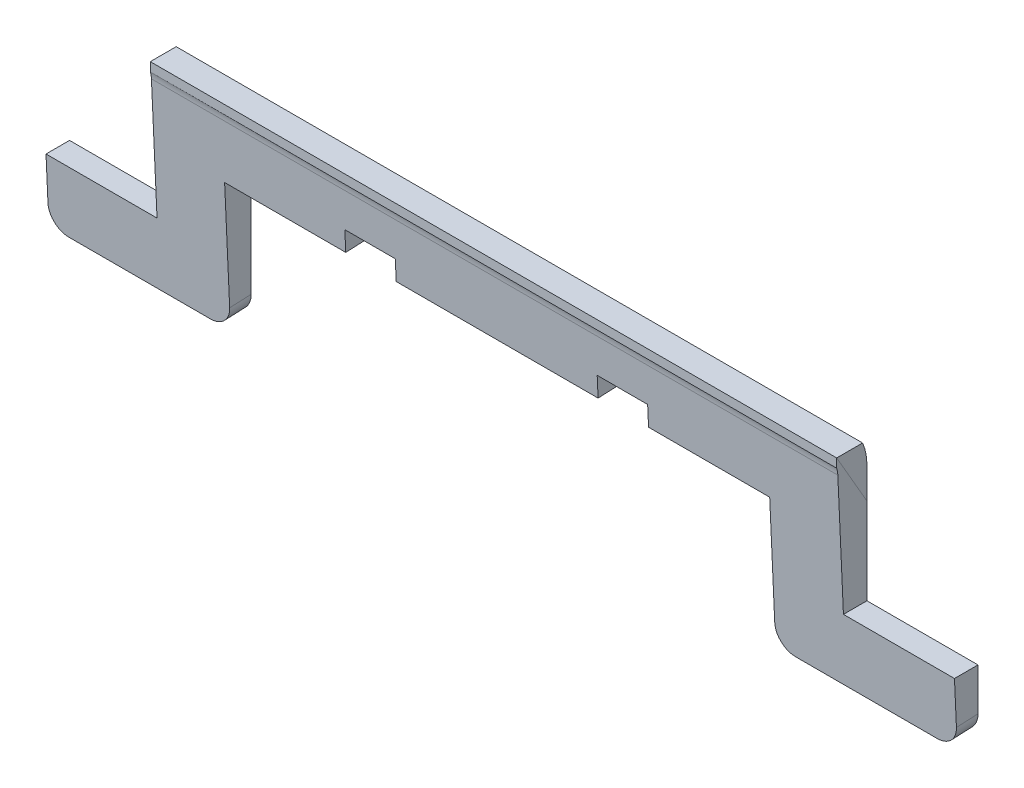
ISO-10303-21;
HEADER;
FILE_DESCRIPTION(('STEP AP214'),'2;1');
FILE_NAME('part.step','',(''),(''),'','','');
FILE_SCHEMA(('AUTOMOTIVE_DESIGN { 1 0 10303 214 1 1 1 1 }'));
ENDSEC;
DATA;
#1=APPLICATION_CONTEXT('core data for automotive mechanical design processes');
#2=APPLICATION_PROTOCOL_DEFINITION('international standard','automotive_design',2000,#1);
#3=PRODUCT_CONTEXT('',#1,'mechanical');
#4=PRODUCT('Part','Part','',(#3));
#5=PRODUCT_RELATED_PRODUCT_CATEGORY('part','',(#4));
#6=PRODUCT_DEFINITION_FORMATION('','',#4);
#7=PRODUCT_DEFINITION_CONTEXT('part definition',#1,'design');
#8=PRODUCT_DEFINITION('design','',#6,#7);
#9=PRODUCT_DEFINITION_SHAPE('','',#8);
#10=(LENGTH_UNIT() NAMED_UNIT(*) SI_UNIT(.MILLI.,.METRE.));
#11=(NAMED_UNIT(*) PLANE_ANGLE_UNIT() SI_UNIT($,.RADIAN.));
#12=(NAMED_UNIT(*) SI_UNIT($,.STERADIAN.) SOLID_ANGLE_UNIT());
#13=UNCERTAINTY_MEASURE_WITH_UNIT(LENGTH_MEASURE(1.E-05),#10,'distance_accuracy_value','');
#14=(GEOMETRIC_REPRESENTATION_CONTEXT(3) GLOBAL_UNCERTAINTY_ASSIGNED_CONTEXT((#13)) GLOBAL_UNIT_ASSIGNED_CONTEXT((#10,
#11,#12)) REPRESENTATION_CONTEXT('',''));
#15=CARTESIAN_POINT('',(0.,0.,0.));
#16=DIRECTION('',(0.,0.,1.));
#17=DIRECTION('',(1.,0.,0.));
#18=AXIS2_PLACEMENT_3D('',#15,#16,#17);
#19=CARTESIAN_POINT('',(-1.35000000265,0.81213740353,-1.75));
#20=DIRECTION('',(7.902277659215E-09,1.,0.));
#21=DIRECTION('',(0.,0.,-1.));
#22=AXIS2_PLACEMENT_3D('',#19,#20,#21);
#23=PLANE('',#22);
#24=DIRECTION('',(0.,0.,1.));
#25=VECTOR('',#24,1.);
#26=CARTESIAN_POINT('',(-2.25,0.812137410642,-1.76781401));
#27=LINE('',#26,#25);
#28=CARTESIAN_POINT('',(-2.25,0.812137410642,-1.75));
#29=VERTEX_POINT('',#28);
#30=CARTESIAN_POINT('',(-2.25,0.812137410642,-1.633424097895));
#31=VERTEX_POINT('',#30);
#32=EDGE_CURVE('E392',#29,#31,#27,.T.);
#33=ORIENTED_EDGE('',*,*,#32,.T.);
#34=DIRECTION('',(1.,-7.902277659215E-09,-3.591944409949E-10));
#35=VECTOR('',#34,1.);
#36=CARTESIAN_POINT('',(-1.800000000058,0.812137407086,-1.633424098055));
#37=LINE('',#36,#35);
#38=CARTESIAN_POINT('',(-1.699999996704,0.812137406296,-1.633424098091));
#39=VERTEX_POINT('',#38);
#40=EDGE_CURVE('E539',#31,#39,#37,.T.);
#41=ORIENTED_EDGE('',*,*,#40,.T.);
#42=DIRECTION('',(0.,0.,1.));
#43=VECTOR('',#42,1.);
#44=CARTESIAN_POINT('',(-1.699999996704,0.812137406296,-1.75));
#45=LINE('',#44,#43);
#46=CARTESIAN_POINT('',(-1.699999996704,0.812137406296,-1.75));
#47=VERTEX_POINT('',#46);
#48=EDGE_CURVE('E11',#47,#39,#45,.T.);
#49=ORIENTED_EDGE('',*,*,#48,.F.);
#50=DIRECTION('',(-1.,7.902277659215E-09,0.));
#51=VECTOR('',#50,1.);
#52=CARTESIAN_POINT('',(-1.850000003015,0.812137407481,-1.75));
#53=LINE('',#52,#51);
#54=EDGE_CURVE('E342',#47,#29,#53,.T.);
#55=ORIENTED_EDGE('',*,*,#54,.T.);
#56=EDGE_LOOP('',(#33,#41,#49,#55));
#57=FACE_BOUND('',#56,.T.);
#58=ADVANCED_FACE('F16',(#57),#23,.T.);
#59=CARTESIAN_POINT('',(-1.699999990368,1.613879977042,-1.75));
#60=DIRECTION('',(-1.,7.902277525616E-09,0.));
#61=DIRECTION('',(0.,0.,1.));
#62=AXIS2_PLACEMENT_3D('',#59,#60,#61);
#63=PLANE('',#62);
#64=DIRECTION('',(0.,0.866025403784329,0.50000000000019));
#65=VECTOR('',#64,1.);
#66=CARTESIAN_POINT('',(-1.7,1.240192378865,-1.75));
#67=LINE('',#66,#65);
#68=CARTESIAN_POINT('',(-1.700000000033,1.240192378865,-1.75));
#69=VERTEX_POINT('',#68);
#70=CARTESIAN_POINT('',(-1.700000000953,1.5,-1.6));
#71=VERTEX_POINT('',#70);
#72=EDGE_CURVE('E378',#69,#71,#67,.T.);
#73=ORIENTED_EDGE('',*,*,#72,.F.);
#74=DIRECTION('',(-7.902277525616E-09,-1.,0.));
#75=VECTOR('',#74,1.);
#76=CARTESIAN_POINT('',(-1.699999991846,1.426939985953,-1.75));
#77=LINE('',#76,#75);
#78=EDGE_CURVE('E347',#69,#47,#77,.T.);
#79=ORIENTED_EDGE('',*,*,#78,.T.);
#80=ORIENTED_EDGE('',*,*,#48,.T.);
#81=DIRECTION('',(7.89412664401439E-09,0.998968540199176,0.045407661163358));
#82=VECTOR('',#81,1.);
#83=CARTESIAN_POINT('',(-1.699999994807,1.052203238069,-1.62251201477));
#84=LINE('',#83,#82);
#85=CARTESIAN_POINT('',(-1.700000000458,1.423370555856,-1.605640773923));
#86=VERTEX_POINT('',#85);
#87=EDGE_CURVE('E445',#39,#86,#84,.T.);
#88=ORIENTED_EDGE('',*,*,#87,.T.);
#89=CARTESIAN_POINT('',(-1.700000000915,1.41746756,-1.475774863));
#90=DIRECTION('',(1.,0.,0.));
#91=DIRECTION('',(0.,-1.,0.));
#92=AXIS2_PLACEMENT_3D('',#89,#90,#91);
#93=CIRCLE('',#92,0.130000001);
#94=CARTESIAN_POINT('',(-1.700000000915,1.455783556013,-1.600000000189));
#95=VERTEX_POINT('',#94);
#96=EDGE_CURVE('E404',#86,#95,#93,.T.);
#97=ORIENTED_EDGE('',*,*,#96,.T.);
#98=DIRECTION('',(-7.902277525616E-09,-1.,0.));
#99=VECTOR('',#98,1.);
#100=CARTESIAN_POINT('',(-1.699999992868,1.297593171494,-1.6));
#101=LINE('',#100,#99);
#102=EDGE_CURVE('E335',#71,#95,#101,.T.);
#103=ORIENTED_EDGE('',*,*,#102,.F.);
#104=EDGE_LOOP('',(#73,#79,#80,#88,#97,#103));
#105=FACE_BOUND('',#104,.T.);
#106=ADVANCED_FACE('F623',(#105),#63,.T.);
#107=CARTESIAN_POINT('',(1.699999998271,0.681198360928,-1.75));
#108=DIRECTION('',(1.,-7.902277525616E-09,0.));
#109=DIRECTION('',(0.,0.,-1.));
#110=AXIS2_PLACEMENT_3D('',#107,#108,#109);
#111=PLANE('',#110);
#112=DIRECTION('',(-7.89412664401439E-09,-0.998968540199176,-0.045407661163358));
#113=VECTOR('',#112,1.);
#114=CARTESIAN_POINT('',(1.699999997525,0.586823944055,-1.643665619157));
#115=LINE('',#114,#113);
#116=CARTESIAN_POINT('',(1.700000000665,1.423370555965,-1.605640773591));
#117=VERTEX_POINT('',#116);
#118=CARTESIAN_POINT('',(1.699999999306,0.812137379428,-1.633424099312));
#119=VERTEX_POINT('',#118);
#120=EDGE_CURVE('E441',#117,#119,#115,.T.);
#121=ORIENTED_EDGE('',*,*,#120,.T.);
#122=DIRECTION('',(0.,0.,1.));
#123=VECTOR('',#122,1.);
#124=CARTESIAN_POINT('',(1.699999999306,0.812137379428,-1.75));
#125=LINE('',#124,#123);
#126=CARTESIAN_POINT('',(1.699999999306,0.812137379428,-1.75));
#127=VERTEX_POINT('',#126);
#128=EDGE_CURVE('E27',#127,#119,#125,.T.);
#129=ORIENTED_EDGE('',*,*,#128,.F.);
#130=DIRECTION('',(7.902277525616E-09,1.,0.));
#131=VECTOR('',#130,1.);
#132=CARTESIAN_POINT('',(1.700000000479,0.960599164462,-1.75));
#133=LINE('',#132,#131);
#134=CARTESIAN_POINT('',(1.6999999996,1.240192378926,-1.750000000128));
#135=VERTEX_POINT('',#134);
#136=EDGE_CURVE('E440',#127,#135,#133,.T.);
#137=ORIENTED_EDGE('',*,*,#136,.T.);
#138=DIRECTION('',(0.,-0.866025403784329,-0.50000000000019));
#139=VECTOR('',#138,1.);
#140=CARTESIAN_POINT('',(1.6999999996,1.240192378926,-1.75));
#141=LINE('',#140,#139);
#142=CARTESIAN_POINT('',(1.7000000002,1.5,-1.600000000035));
#143=VERTEX_POINT('',#142);
#144=EDGE_CURVE('E496',#143,#135,#141,.T.);
#145=ORIENTED_EDGE('',*,*,#144,.F.);
#146=DIRECTION('',(7.902277525616E-09,1.,0.));
#147=VECTOR('',#146,1.);
#148=CARTESIAN_POINT('',(1.699999999457,0.831252350003,-1.6));
#149=LINE('',#148,#147);
#150=CARTESIAN_POINT('',(1.700000000336,1.455783556074,-1.600000000147));
#151=VERTEX_POINT('',#150);
#152=EDGE_CURVE('E369',#151,#143,#149,.T.);
#153=ORIENTED_EDGE('',*,*,#152,.F.);
#154=CARTESIAN_POINT('',(1.700000000665,1.41746756,-1.475774863));
#155=DIRECTION('',(-1.,0.,0.));
#156=DIRECTION('',(0.,-1.,0.));
#157=AXIS2_PLACEMENT_3D('',#154,#155,#156);
#158=CIRCLE('',#157,0.130000001);
#159=EDGE_CURVE('E313',#151,#117,#158,.T.);
#160=ORIENTED_EDGE('',*,*,#159,.T.);
#161=EDGE_LOOP('',(#121,#129,#137,#145,#153,#160));
#162=FACE_BOUND('',#161,.T.);
#163=ADVANCED_FACE('F629',(#162),#111,.T.);
#164=CARTESIAN_POINT('',(2.400105974106,0.812137373895,-1.75));
#165=DIRECTION('',(7.902277525616E-09,1.,0.));
#166=DIRECTION('',(0.,0.,-1.));
#167=AXIS2_PLACEMENT_3D('',#164,#165,#166);
#168=PLANE('',#167);
#169=DIRECTION('',(0.,0.,-1.));
#170=VECTOR('',#169,1.);
#171=CARTESIAN_POINT('',(2.25,0.812137375082,-1.6965932535));
#172=LINE('',#171,#170);
#173=CARTESIAN_POINT('',(2.25,0.812137375082,-1.633424099241));
#174=VERTEX_POINT('',#173);
#175=CARTESIAN_POINT('',(2.25,0.812137375082,-1.75));
#176=VERTEX_POINT('',#175);
#177=EDGE_CURVE('E20',#174,#176,#172,.T.);
#178=ORIENTED_EDGE('',*,*,#177,.T.);
#179=DIRECTION('',(-1.,7.902277525616E-09,0.));
#180=VECTOR('',#179,1.);
#181=CARTESIAN_POINT('',(0.02505298536236,0.812137392664,-1.75));
#182=LINE('',#181,#180);
#183=EDGE_CURVE('E306',#176,#127,#182,.T.);
#184=ORIENTED_EDGE('',*,*,#183,.T.);
#185=ORIENTED_EDGE('',*,*,#128,.T.);
#186=DIRECTION('',(1.,-7.902277525616E-09,-3.591944349222E-10));
#187=VECTOR('',#186,1.);
#188=CARTESIAN_POINT('',(0.07505298831971,0.812137392269,-1.633424098729));
#189=LINE('',#188,#187);
#190=EDGE_CURVE('E446',#119,#174,#189,.T.);
#191=ORIENTED_EDGE('',*,*,#190,.T.);
#192=EDGE_LOOP('',(#178,#184,#185,#191));
#193=FACE_BOUND('',#192,.T.);
#194=ADVANCED_FACE('F648',(#193),#168,.T.);
#195=CARTESIAN_POINT('',(-2.25,0.49746756,-1.647727273));
#196=DIRECTION('',(0.,0.045407661163358,-0.998968540199176));
#197=DIRECTION('',(-1.,0.,0.));
#198=AXIS2_PLACEMENT_3D('',#195,#196,#197);
#199=PLANE('',#198);
#200=ORIENTED_EDGE('',*,*,#190,.F.);
#201=ORIENTED_EDGE('',*,*,#120,.F.);
#202=DIRECTION('',(-1.,0.,0.));
#203=VECTOR('',#202,1.);
#204=CARTESIAN_POINT('',(1.72216727,1.423370555992,-1.605640774225));
#205=LINE('',#204,#203);
#206=EDGE_CURVE('E482',#117,#86,#205,.T.);
#207=ORIENTED_EDGE('',*,*,#206,.T.);
#208=ORIENTED_EDGE('',*,*,#87,.F.);
#209=ORIENTED_EDGE('',*,*,#40,.F.);
#210=DIRECTION('',(0.,-0.998968540182468,-0.0454076615309513));
#211=VECTOR('',#210,1.);
#212=CARTESIAN_POINT('',(-2.25,0.869994434875,-1.630794233121));
#213=LINE('',#212,#211);
#214=CARTESIAN_POINT('',(-2.25,0.597364413251,-1.643186506999));
#215=VERTEX_POINT('',#214);
#216=EDGE_CURVE('E381',#31,#215,#213,.T.);
#217=ORIENTED_EDGE('',*,*,#216,.T.);
#218=CARTESIAN_POINT('',(-2.150000000774,0.597364413247,-1.643186506919));
#219=DIRECTION('',(0.,-0.0454076611633578,0.998968540199176));
#220=DIRECTION('',(0.,0.998968540199176,0.0454076611633578));
#221=AXIS2_PLACEMENT_3D('',#218,#219,#220);
#222=CIRCLE('',#221,0.09999999922649);
#223=CARTESIAN_POINT('',(-2.150000000774,0.497467560004,-1.647727273091));
#224=VERTEX_POINT('',#223);
#225=EDGE_CURVE('E418',#215,#224,#222,.T.);
#226=ORIENTED_EDGE('',*,*,#225,.T.);
#227=DIRECTION('',(1.,0.,0.));
#228=VECTOR('',#227,1.);
#229=CARTESIAN_POINT('',(-2.15,0.497467560004,-1.647727273091));
#230=LINE('',#229,#228);
#231=CARTESIAN_POINT('',(-1.449999999226,0.497467560004,-1.647727273091));
#232=VERTEX_POINT('',#231);
#233=EDGE_CURVE('E321',#224,#232,#230,.T.);
#234=ORIENTED_EDGE('',*,*,#233,.T.);
#235=CARTESIAN_POINT('',(-1.449999999226,0.597364413247,-1.643186506919));
#236=DIRECTION('',(0.,-0.0454076611633578,0.998968540199176));
#237=DIRECTION('',(0.,0.998968540199176,0.0454076611633578));
#238=AXIS2_PLACEMENT_3D('',#235,#236,#237);
#239=CIRCLE('',#238,0.09999999922649);
#240=CARTESIAN_POINT('',(-1.35,0.597364413252,-1.643186507022));
#241=VERTEX_POINT('',#240);
#242=EDGE_CURVE('E435',#232,#241,#239,.T.);
#243=ORIENTED_EDGE('',*,*,#242,.T.);
#244=DIRECTION('',(0.,0.998968540190678,0.0454076613503353));
#245=VECTOR('',#244,1.);
#246=CARTESIAN_POINT('',(-1.35,0.597364413631,-1.643186507005));
#247=LINE('',#246,#245);
#248=CARTESIAN_POINT('',(-1.35,1.147467559702,-1.618181818309));
#249=VERTEX_POINT('',#248);
#250=EDGE_CURVE('E331',#241,#249,#247,.T.);
#251=ORIENTED_EDGE('',*,*,#250,.T.);
#252=DIRECTION('',(1.,0.,0.));
#253=VECTOR('',#252,1.);
#254=CARTESIAN_POINT('',(-1.35,1.147467560013,-1.618181818294));
#255=LINE('',#254,#253);
#256=CARTESIAN_POINT('',(-0.75,1.147467560013,-1.618181818294));
#257=VERTEX_POINT('',#256);
#258=EDGE_CURVE('E483',#249,#257,#255,.T.);
#259=ORIENTED_EDGE('',*,*,#258,.T.);
#260=DIRECTION('',(0.,-0.998968540199176,-0.045407661163358));
#261=VECTOR('',#260,1.);
#262=CARTESIAN_POINT('',(-0.75,1.247467559705,-1.613636363738));
#263=LINE('',#262,#261);
#264=CARTESIAN_POINT('',(-0.75,1.247467559705,-1.613636363738));
#265=VERTEX_POINT('',#264);
#266=EDGE_CURVE('E489',#265,#257,#263,.T.);
#267=ORIENTED_EDGE('',*,*,#266,.F.);
#268=DIRECTION('',(1.,0.,0.));
#269=VECTOR('',#268,1.);
#270=CARTESIAN_POINT('',(-0.75,1.247467559705,-1.613636363738));
#271=LINE('',#270,#269);
#272=CARTESIAN_POINT('',(-0.499999999667,1.247467559767,-1.613636365107));
#273=VERTEX_POINT('',#272);
#274=EDGE_CURVE('E348',#265,#273,#271,.T.);
#275=ORIENTED_EDGE('',*,*,#274,.T.);
#276=DIRECTION('',(0.,0.998968540199176,0.045407661163358));
#277=VECTOR('',#276,1.);
#278=CARTESIAN_POINT('',(-0.499999999667,1.147467559843,-1.618181820771));
#279=LINE('',#278,#277);
#280=CARTESIAN_POINT('',(-0.499999999667,1.147467559806,-1.61818181995));
#281=VERTEX_POINT('',#280);
#282=EDGE_CURVE('E430',#281,#273,#279,.T.);
#283=ORIENTED_EDGE('',*,*,#282,.F.);
#284=DIRECTION('',(-1.,0.,0.));
#285=VECTOR('',#284,1.);
#286=CARTESIAN_POINT('',(-0.499999999667,1.147467559843,-1.618181820771));
#287=LINE('',#286,#285);
#288=CARTESIAN_POINT('',(0.499999999667,1.147467559806,-1.61818181995));
#289=VERTEX_POINT('',#288);
#290=EDGE_CURVE('E575',#289,#281,#287,.T.);
#291=ORIENTED_EDGE('',*,*,#290,.F.);
#292=DIRECTION('',(0.,0.998968540199176,0.045407661163358));
#293=VECTOR('',#292,1.);
#294=CARTESIAN_POINT('',(0.499999999667,1.147467559843,-1.618181820771));
#295=LINE('',#294,#293);
#296=CARTESIAN_POINT('',(0.499999999667,1.247467559743,-1.61363636456));
#297=VERTEX_POINT('',#296);
#298=EDGE_CURVE('E459',#289,#297,#295,.T.);
#299=ORIENTED_EDGE('',*,*,#298,.T.);
#300=DIRECTION('',(1.,0.,0.));
#301=VECTOR('',#300,1.);
#302=CARTESIAN_POINT('',(-0.75,1.247467559705,-1.613636363738));
#303=LINE('',#302,#301);
#304=CARTESIAN_POINT('',(0.750000001,1.247467559705,-1.613636363738));
#305=VERTEX_POINT('',#304);
#306=EDGE_CURVE('E352',#297,#305,#303,.T.);
#307=ORIENTED_EDGE('',*,*,#306,.T.);
#308=DIRECTION('',(0.,-0.998968540199176,-0.045407661163358));
#309=VECTOR('',#308,1.);
#310=CARTESIAN_POINT('',(0.750000001,1.247467559705,-1.613636363738));
#311=LINE('',#310,#309);
#312=CARTESIAN_POINT('',(0.750000001,1.147467560013,-1.618181818294));
#313=VERTEX_POINT('',#312);
#314=EDGE_CURVE('E533',#305,#313,#311,.T.);
#315=ORIENTED_EDGE('',*,*,#314,.T.);
#316=DIRECTION('',(1.,0.,0.));
#317=VECTOR('',#316,1.);
#318=CARTESIAN_POINT('',(0.75,1.147467560013,-1.618181818294));
#319=LINE('',#318,#317);
#320=CARTESIAN_POINT('',(1.35,1.147467560013,-1.618181818294));
#321=VERTEX_POINT('',#320);
#322=EDGE_CURVE('E467',#313,#321,#319,.T.);
#323=ORIENTED_EDGE('',*,*,#322,.T.);
#324=DIRECTION('',(0.,-0.998968540192551,-0.0454076613091296));
#325=VECTOR('',#324,1.);
#326=CARTESIAN_POINT('',(1.35,1.147467559547,-1.618181818316));
#327=LINE('',#326,#325);
#328=CARTESIAN_POINT('',(1.35,0.597364413251,-1.643186506999));
#329=VERTEX_POINT('',#328);
#330=EDGE_CURVE('E500',#321,#329,#327,.T.);
#331=ORIENTED_EDGE('',*,*,#330,.T.);
#332=CARTESIAN_POINT('',(1.449999999226,0.597364413247,-1.643186506919));
#333=DIRECTION('',(0.,-0.0454076611633578,0.998968540199176));
#334=DIRECTION('',(0.,0.998968540199176,0.0454076611633578));
#335=AXIS2_PLACEMENT_3D('',#332,#333,#334);
#336=CIRCLE('',#335,0.09999999922649);
#337=CARTESIAN_POINT('',(1.449999999226,0.497467560004,-1.647727273091));
#338=VERTEX_POINT('',#337);
#339=EDGE_CURVE('E360',#329,#338,#336,.T.);
#340=ORIENTED_EDGE('',*,*,#339,.T.);
#341=DIRECTION('',(1.,0.,0.));
#342=VECTOR('',#341,1.);
#343=CARTESIAN_POINT('',(1.45,0.497467560004,-1.647727273091));
#344=LINE('',#343,#342);
#345=CARTESIAN_POINT('',(2.150000000774,0.497467560004,-1.647727273091));
#346=VERTEX_POINT('',#345);
#347=EDGE_CURVE('E529',#338,#346,#344,.T.);
#348=ORIENTED_EDGE('',*,*,#347,.T.);
#349=CARTESIAN_POINT('',(2.150000000774,0.597364413247,-1.643186506919));
#350=DIRECTION('',(0.,-0.0454076611633578,0.998968540199176));
#351=DIRECTION('',(0.,0.998968540199176,0.0454076611633578));
#352=AXIS2_PLACEMENT_3D('',#349,#350,#351);
#353=CIRCLE('',#352,0.09999999922649);
#354=CARTESIAN_POINT('',(2.25,0.597364413252,-1.643186507028));
#355=VERTEX_POINT('',#354);
#356=EDGE_CURVE('E292',#346,#355,#353,.T.);
#357=ORIENTED_EDGE('',*,*,#356,.T.);
#358=DIRECTION('',(0.,0.998968540119427,0.0454076629178494));
#359=VECTOR('',#358,1.);
#360=CARTESIAN_POINT('',(2.25,0.597364413816,-1.643186507002));
#361=LINE('',#360,#359);
#362=EDGE_CURVE('E289',#355,#174,#361,.T.);
#363=ORIENTED_EDGE('',*,*,#362,.T.);
#364=EDGE_LOOP('',(#200,#201,#207,#208,#209,#217,#226,#234,#243,#251,#259,#267,#275,#283,#291,
#299,#307,#315,#323,#331,#340,#348,#357,#363));
#365=FACE_BOUND('',#364,.T.);
#366=ADVANCED_FACE('F603',(#365),#199,.F.);
#367=CARTESIAN_POINT('',(2.150000000774,0.603839027256,-1.785628020102));
#368=DIRECTION('',(0.,-0.0454076593280117,0.998968540282601));
#369=DIRECTION('',(0.,-0.998968540282601,-0.0454076593280117));
#370=AXIS2_PLACEMENT_3D('',#367,#368,#369);
#371=CYLINDRICAL_SURFACE('',#370,0.09999999922649);
#372=CARTESIAN_POINT('',(2.150000000774,0.502116320155,-1.75));
#373=CARTESIAN_POINT('',(2.20857864408358,0.502116320155,-1.75));
#374=CARTESIAN_POINT('',(2.25000000000049,0.543580444645959,-1.75));
#375=CARTESIAN_POINT('',(2.25,0.602219571853,-1.75));
#376=(BOUNDED_CURVE() B_SPLINE_CURVE(3,(#372,#373,#374,#375),.UNSPECIFIED.,.F.,
.F.) B_SPLINE_CURVE_WITH_KNOTS((4,4),(0.,1.5707963267949),
.UNSPECIFIED.) CURVE() GEOMETRIC_REPRESENTATION_ITEM() RATIONAL_B_SPLINE_CURVE((1.,
0.804737854124365,0.804737854124365,1.)) REPRESENTATION_ITEM(''));
#377=CARTESIAN_POINT('',(2.150000000774,0.502116320155,-1.75));
#378=VERTEX_POINT('',#377);
#379=CARTESIAN_POINT('',(2.25,0.602219571853,-1.75));
#380=VERTEX_POINT('',#379);
#381=EDGE_CURVE('E295',#378,#380,#376,.T.);
#382=ORIENTED_EDGE('',*,*,#381,.T.);
#383=DIRECTION('',(0.,0.0454076593280119,-0.998968540282601));
#384=VECTOR('',#383,1.);
#385=CARTESIAN_POINT('',(2.25,0.597364413252,-1.643186507034));
#386=LINE('',#385,#384);
#387=EDGE_CURVE('E281',#355,#380,#386,.T.);
#388=ORIENTED_EDGE('',*,*,#387,.F.);
#389=ORIENTED_EDGE('',*,*,#356,.F.);
#390=DIRECTION('',(0.,-0.0454076593280119,0.998968540282601));
#391=VECTOR('',#390,1.);
#392=CARTESIAN_POINT('',(2.150000000774,0.503942174,-1.790168786));
#393=LINE('',#392,#391);
#394=EDGE_CURVE('E298',#378,#346,#393,.T.);
#395=ORIENTED_EDGE('',*,*,#394,.F.);
#396=EDGE_LOOP('',(#382,#388,#389,#395));
#397=FACE_BOUND('',#396,.T.);
#398=ADVANCED_FACE('F296',(#397),#371,.T.);
#399=CARTESIAN_POINT('',(2.25,0.597364414,-1.643186507));
#400=DIRECTION('',(-1.,0.,0.));
#401=DIRECTION('',(0.,0.,1.));
#402=AXIS2_PLACEMENT_3D('',#399,#400,#401);
#403=PLANE('',#402);
#404=ORIENTED_EDGE('',*,*,#177,.F.);
#405=ORIENTED_EDGE('',*,*,#362,.F.);
#406=ORIENTED_EDGE('',*,*,#387,.T.);
#407=DIRECTION('',(0.,1.,0.));
#408=VECTOR('',#407,1.);
#409=CARTESIAN_POINT('',(2.25,0.662994821677,-1.75));
#410=LINE('',#409,#408);
#411=EDGE_CURVE('E286',#380,#176,#410,.T.);
#412=ORIENTED_EDGE('',*,*,#411,.T.);
#413=EDGE_LOOP('',(#404,#405,#406,#412));
#414=FACE_BOUND('',#413,.T.);
#415=ADVANCED_FACE('F284',(#414),#403,.F.);
#416=CARTESIAN_POINT('',(1.7,0.908438211,-1.573580715));
#417=DIRECTION('',(1.,0.,0.));
#418=DIRECTION('',(0.,1.,0.));
#419=AXIS2_PLACEMENT_3D('',#416,#417,#418);
#420=PLANE('',#419);
#421=DIRECTION('',(0.,1.,0.));
#422=VECTOR('',#421,1.);
#423=CARTESIAN_POINT('',(1.7,0.818531720177,-1.75));
#424=LINE('',#423,#422);
#425=CARTESIAN_POINT('',(1.6999999998,1.387655462182,-1.75));
#426=VERTEX_POINT('',#425);
#427=EDGE_CURVE('E376',#135,#426,#424,.T.);
#428=ORIENTED_EDGE('',*,*,#427,.T.);
#429=DIRECTION('',(0.,-0.998968540201401,-0.0454076611144282));
#430=VECTOR('',#429,1.);
#431=CARTESIAN_POINT('',(1.6999999998,0.503942174,-1.790168786));
#432=LINE('',#431,#430);
#433=CARTESIAN_POINT('',(1.6999999998,1.411408062279,-1.748920336355));
#434=VERTEX_POINT('',#433);
#435=EDGE_CURVE('E390',#434,#426,#432,.T.);
#436=ORIENTED_EDGE('',*,*,#435,.F.);
#437=CARTESIAN_POINT('',(1.7,1.400056147,-1.499178201304));
#438=DIRECTION('',(1.,0.,0.));
#439=DIRECTION('',(0.,0.,-1.));
#440=AXIS2_PLACEMENT_3D('',#437,#438,#439);
#441=CIRCLE('',#440,0.25);
#442=CARTESIAN_POINT('',(1.7,1.5,-1.728331482423));
#443=VERTEX_POINT('',#442);
#444=EDGE_CURVE('E528',#434,#443,#441,.T.);
#445=ORIENTED_EDGE('',*,*,#444,.T.);
#446=DIRECTION('',(0.,0.,1.));
#447=VECTOR('',#446,1.);
#448=CARTESIAN_POINT('',(1.7,1.5,-0.906512355152));
#449=LINE('',#448,#447);
#450=EDGE_CURVE('E351',#443,#143,#449,.T.);
#451=ORIENTED_EDGE('',*,*,#450,.T.);
#452=ORIENTED_EDGE('',*,*,#144,.T.);
#453=EDGE_LOOP('',(#428,#436,#445,#451,#452));
#454=FACE_BOUND('',#453,.T.);
#455=ADVANCED_FACE('F1006',(#454),#420,.T.);
#456=CARTESIAN_POINT('',(-2.25,0.503942174,-1.790168786));
#457=DIRECTION('',(0.,0.0454076611144282,-0.998968540201401));
#458=DIRECTION('',(-1.,0.,0.));
#459=AXIS2_PLACEMENT_3D('',#456,#457,#458);
#460=PLANE('',#459);
#461=DIRECTION('',(-1.,0.,0.));
#462=VECTOR('',#461,1.);
#463=CARTESIAN_POINT('',(-1.01451174871,1.387655462182,-1.75));
#464=LINE('',#463,#462);
#465=CARTESIAN_POINT('',(-1.7,1.38765548905,-1.75));
#466=VERTEX_POINT('',#465);
#467=EDGE_CURVE('E373',#426,#466,#464,.T.);
#468=ORIENTED_EDGE('',*,*,#467,.T.);
#469=DIRECTION('',(0.,-0.99896854031601,-0.0454076585930105));
#470=VECTOR('',#469,1.);
#471=CARTESIAN_POINT('',(-1.7,1.429845170091,-1.748082287324));
#472=LINE('',#471,#470);
#473=CARTESIAN_POINT('',(-1.700000000011,1.411408062298,-1.748920336781));
#474=VERTEX_POINT('',#473);
#475=EDGE_CURVE('E380',#474,#466,#472,.T.);
#476=ORIENTED_EDGE('',*,*,#475,.F.);
#477=DIRECTION('',(1.,0.,0.));
#478=VECTOR('',#477,1.);
#479=CARTESIAN_POINT('',(-2.25,1.411408062279,-1.748920336355));
#480=LINE('',#479,#478);
#481=EDGE_CURVE('E519',#474,#434,#480,.T.);
#482=ORIENTED_EDGE('',*,*,#481,.T.);
#483=ORIENTED_EDGE('',*,*,#435,.T.);
#484=EDGE_LOOP('',(#468,#476,#482,#483));
#485=FACE_BOUND('',#484,.T.);
#486=ADVANCED_FACE('F1056',(#485),#460,.T.);
#487=CARTESIAN_POINT('',(-1.700000000033,0.912528066556,-1.75000000017));
#488=DIRECTION('',(-1.,0.,0.));
#489=DIRECTION('',(0.,0.,1.));
#490=AXIS2_PLACEMENT_3D('',#487,#488,#489);
#491=PLANE('',#490);
#492=DIRECTION('',(0.,-1.,0.));
#493=VECTOR('',#492,1.);
#494=CARTESIAN_POINT('',(-1.700000000033,0.820576647955,-1.75));
#495=LINE('',#494,#493);
#496=EDGE_CURVE('E377',#466,#69,#495,.T.);
#497=ORIENTED_EDGE('',*,*,#496,.T.);
#498=ORIENTED_EDGE('',*,*,#72,.T.);
#499=DIRECTION('',(0.,0.,-1.));
#500=VECTOR('',#499,1.);
#501=CARTESIAN_POINT('',(-1.700000000033,1.5,-0.994721997737));
#502=LINE('',#501,#500);
#503=CARTESIAN_POINT('',(-1.700000000033,1.5,-1.728331482423));
#504=VERTEX_POINT('',#503);
#505=EDGE_CURVE('E424',#71,#504,#502,.T.);
#506=ORIENTED_EDGE('',*,*,#505,.T.);
#507=CARTESIAN_POINT('',(-1.700000000033,1.400056147,-1.499178201304));
#508=DIRECTION('',(-1.,0.,0.));
#509=DIRECTION('',(0.,0.,1.));
#510=AXIS2_PLACEMENT_3D('',#507,#508,#509);
#511=CIRCLE('',#510,0.25);
#512=EDGE_CURVE('E515',#504,#474,#511,.T.);
#513=ORIENTED_EDGE('',*,*,#512,.T.);
#514=ORIENTED_EDGE('',*,*,#475,.T.);
#515=EDGE_LOOP('',(#497,#498,#506,#513,#514));
#516=FACE_BOUND('',#515,.T.);
#517=ADVANCED_FACE('F740',(#516),#491,.T.);
#518=CARTESIAN_POINT('',(-2.25,0.603839028,-1.78562802));
#519=DIRECTION('',(1.,0.,0.));
#520=DIRECTION('',(0.,1.,0.));
#521=AXIS2_PLACEMENT_3D('',#518,#519,#520);
#522=PLANE('',#521);
#523=ORIENTED_EDGE('',*,*,#32,.F.);
#524=DIRECTION('',(0.,-1.,0.));
#525=VECTOR('',#524,1.);
#526=CARTESIAN_POINT('',(-2.25,0.666232128677,-1.75));
#527=LINE('',#526,#525);
#528=CARTESIAN_POINT('',(-2.25,0.602219571853,-1.75));
#529=VERTEX_POINT('',#528);
#530=EDGE_CURVE('E338',#29,#529,#527,.T.);
#531=ORIENTED_EDGE('',*,*,#530,.T.);
#532=DIRECTION('',(0.,-0.0454076593280119,0.998968540282601));
#533=VECTOR('',#532,1.);
#534=CARTESIAN_POINT('',(-2.25,0.603839027252,-1.785628020034));
#535=LINE('',#534,#533);
#536=EDGE_CURVE('E401',#529,#215,#535,.T.);
#537=ORIENTED_EDGE('',*,*,#536,.T.);
#538=ORIENTED_EDGE('',*,*,#216,.F.);
#539=EDGE_LOOP('',(#523,#531,#537,#538));
#540=FACE_BOUND('',#539,.T.);
#541=ADVANCED_FACE('F734',(#540),#522,.F.);
#542=CARTESIAN_POINT('',(-2.150000000774,0.603839027252,-1.785628020034));
#543=DIRECTION('',(0.,-0.0454076593280117,0.998968540282601));
#544=DIRECTION('',(0.,-0.998968540282601,-0.0454076593280117));
#545=AXIS2_PLACEMENT_3D('',#542,#543,#544);
#546=CYLINDRICAL_SURFACE('',#545,0.09999999922649);
#547=CARTESIAN_POINT('',(-2.25,0.602219571853,-1.75));
#548=CARTESIAN_POINT('',(-2.25000000000049,0.543580444645959,-1.75));
#549=CARTESIAN_POINT('',(-2.20857864408358,0.502116320155,-1.75));
#550=CARTESIAN_POINT('',(-2.150000000774,0.502116320155,-1.75));
#551=(BOUNDED_CURVE() B_SPLINE_CURVE(3,(#547,#548,#549,#550),.UNSPECIFIED.,.F.,
.F.) B_SPLINE_CURVE_WITH_KNOTS((4,4),(4.71238898038469,6.28318530717959),
.UNSPECIFIED.) CURVE() GEOMETRIC_REPRESENTATION_ITEM() RATIONAL_B_SPLINE_CURVE((1.,
0.804737854124365,0.804737854124365,1.)) REPRESENTATION_ITEM(''));
#552=CARTESIAN_POINT('',(-2.150000000774,0.502116320155,-1.75));
#553=VERTEX_POINT('',#552);
#554=EDGE_CURVE('E343',#529,#553,#551,.T.);
#555=ORIENTED_EDGE('',*,*,#554,.T.);
#556=DIRECTION('',(0.,0.0454076593280119,-0.998968540282601));
#557=VECTOR('',#556,1.);
#558=CARTESIAN_POINT('',(-2.150000000774,0.503942174,-1.790168786));
#559=LINE('',#558,#557);
#560=EDGE_CURVE('E324',#224,#553,#559,.T.);
#561=ORIENTED_EDGE('',*,*,#560,.F.);
#562=ORIENTED_EDGE('',*,*,#225,.F.);
#563=ORIENTED_EDGE('',*,*,#536,.F.);
#564=EDGE_LOOP('',(#555,#561,#562,#563));
#565=FACE_BOUND('',#564,.T.);
#566=ADVANCED_FACE('F732',(#565),#546,.T.);
#567=CARTESIAN_POINT('',(1.45,1.5,-1.6));
#568=DIRECTION('',(0.,1.,0.));
#569=DIRECTION('',(1.,0.,0.));
#570=AXIS2_PLACEMENT_3D('',#567,#568,#569);
#571=PLANE('',#570);
#572=DIRECTION('',(-1.,0.,0.));
#573=VECTOR('',#572,1.);
#574=CARTESIAN_POINT('',(0.727836362479,1.5,-1.6));
#575=LINE('',#574,#573);
#576=EDGE_CURVE('E332',#143,#71,#575,.T.);
#577=ORIENTED_EDGE('',*,*,#576,.F.);
#578=ORIENTED_EDGE('',*,*,#450,.F.);
#579=DIRECTION('',(1.,0.,0.));
#580=VECTOR('',#579,1.);
#581=CARTESIAN_POINT('',(-2.25,1.5,-1.728331482423));
#582=LINE('',#581,#580);
#583=EDGE_CURVE('E524',#504,#443,#582,.T.);
#584=ORIENTED_EDGE('',*,*,#583,.F.);
#585=ORIENTED_EDGE('',*,*,#505,.F.);
#586=EDGE_LOOP('',(#577,#578,#584,#585));
#587=FACE_BOUND('',#586,.T.);
#588=ADVANCED_FACE('F1013',(#587),#571,.T.);
#589=CARTESIAN_POINT('',(-0.75,1.253942173969,-1.756077876763));
#590=DIRECTION('',(0.,0.998968540199176,0.045407661163358));
#591=DIRECTION('',(1.,0.,0.));
#592=AXIS2_PLACEMENT_3D('',#589,#590,#591);
#593=PLANE('',#592);
#594=DIRECTION('',(1.,0.,0.));
#595=VECTOR('',#594,1.);
#596=CARTESIAN_POINT('',(-0.26451174871,1.253665906841,-1.75));
#597=LINE('',#596,#595);
#598=CARTESIAN_POINT('',(-0.75,1.253665906841,-1.75));
#599=VERTEX_POINT('',#598);
#600=CARTESIAN_POINT('',(-0.499999999667,1.253665906841,-1.75));
#601=VERTEX_POINT('',#600);
#602=EDGE_CURVE('E194',#599,#601,#597,.T.);
#603=ORIENTED_EDGE('',*,*,#602,.T.);
#604=DIRECTION('',(0.,0.045407661163358,-0.998968540199176));
#605=VECTOR('',#604,1.);
#606=CARTESIAN_POINT('',(-0.499999999667,1.25394217408,-1.756077879222));
#607=LINE('',#606,#605);
#608=EDGE_CURVE('E425',#273,#601,#607,.T.);
#609=ORIENTED_EDGE('',*,*,#608,.F.);
#610=ORIENTED_EDGE('',*,*,#274,.F.);
#611=DIRECTION('',(0.,-0.045407661163358,0.998968540199176));
#612=VECTOR('',#611,1.);
#613=CARTESIAN_POINT('',(-0.75,1.253942173969,-1.756077876763));
#614=LINE('',#613,#612);
#615=EDGE_CURVE('E560',#599,#265,#614,.T.);
#616=ORIENTED_EDGE('',*,*,#615,.F.);
#617=EDGE_LOOP('',(#603,#609,#610,#616));
#618=FACE_BOUND('',#617,.T.);
#619=ADVANCED_FACE('F618',(#618),#593,.F.);
#620=CARTESIAN_POINT('',(-0.75,1.253942173969,-1.756077876763));
#621=DIRECTION('',(0.,0.998968540199176,0.045407661163358));
#622=DIRECTION('',(1.,0.,0.));
#623=AXIS2_PLACEMENT_3D('',#620,#621,#622);
#624=PLANE('',#623);
#625=DIRECTION('',(1.,0.,0.));
#626=VECTOR('',#625,1.);
#627=CARTESIAN_POINT('',(-0.26451174871,1.253665906841,-1.75));
#628=LINE('',#627,#626);
#629=CARTESIAN_POINT('',(0.499999999667,1.253665906841,-1.75));
#630=VERTEX_POINT('',#629);
#631=CARTESIAN_POINT('',(0.750000001,1.253665906841,-1.75));
#632=VERTEX_POINT('',#631);
#633=EDGE_CURVE('E301',#630,#632,#628,.T.);
#634=ORIENTED_EDGE('',*,*,#633,.T.);
#635=DIRECTION('',(0.,-0.045407661163358,0.998968540199176));
#636=VECTOR('',#635,1.);
#637=CARTESIAN_POINT('',(0.750000001,1.253942173969,-1.756077876763));
#638=LINE('',#637,#636);
#639=EDGE_CURVE('E537',#632,#305,#638,.T.);
#640=ORIENTED_EDGE('',*,*,#639,.T.);
#641=ORIENTED_EDGE('',*,*,#306,.F.);
#642=DIRECTION('',(0.,-0.045407661163358,0.998968540199176));
#643=VECTOR('',#642,1.);
#644=CARTESIAN_POINT('',(0.499999999667,1.247467559817,-1.613636366202));
#645=LINE('',#644,#643);
#646=EDGE_CURVE('E464',#630,#297,#645,.T.);
#647=ORIENTED_EDGE('',*,*,#646,.F.);
#648=EDGE_LOOP('',(#634,#640,#641,#647));
#649=FACE_BOUND('',#648,.T.);
#650=ADVANCED_FACE('F609',(#649),#624,.F.);
#651=CARTESIAN_POINT('',(-1.35,1.153942174,-1.760623331));
#652=DIRECTION('',(0.,0.998968540282601,0.0454076593280119));
#653=DIRECTION('',(1.,0.,0.));
#654=AXIS2_PLACEMENT_3D('',#651,#652,#653);
#655=PLANE('',#654);
#656=DIRECTION('',(1.,0.,0.));
#657=VECTOR('',#656,1.);
#658=CARTESIAN_POINT('',(-0.56451174871,1.153459295335,-1.75));
#659=LINE('',#658,#657);
#660=CARTESIAN_POINT('',(-1.35,1.153459295301,-1.75));
#661=VERTEX_POINT('',#660);
#662=CARTESIAN_POINT('',(-0.75,1.153459295578,-1.75));
#663=VERTEX_POINT('',#662);
#664=EDGE_CURVE('E207',#661,#663,#659,.T.);
#665=ORIENTED_EDGE('',*,*,#664,.T.);
#666=DIRECTION('',(0.,0.045407661163358,-0.998968540199176));
#667=VECTOR('',#666,1.);
#668=CARTESIAN_POINT('',(-0.75,1.147467560013,-1.618181818294));
#669=LINE('',#668,#667);
#670=EDGE_CURVE('E372',#257,#663,#669,.T.);
#671=ORIENTED_EDGE('',*,*,#670,.F.);
#672=ORIENTED_EDGE('',*,*,#258,.F.);
#673=DIRECTION('',(0.,0.045407662603507,-0.998968540133715));
#674=VECTOR('',#673,1.);
#675=CARTESIAN_POINT('',(-1.35,1.147467559547,-1.618181818316));
#676=LINE('',#675,#674);
#677=EDGE_CURVE('E330',#249,#661,#676,.T.);
#678=ORIENTED_EDGE('',*,*,#677,.T.);
#679=EDGE_LOOP('',(#665,#671,#672,#678));
#680=FACE_BOUND('',#679,.T.);
#681=ADVANCED_FACE('F607',(#680),#655,.F.);
#682=CARTESIAN_POINT('',(-2.35,1.24,-1.75));
#683=DIRECTION('',(0.,0.,-1.));
#684=DIRECTION('',(0.,-1.,0.));
#685=AXIS2_PLACEMENT_3D('',#682,#683,#684);
#686=PLANE('',#685);
#687=ORIENTED_EDGE('',*,*,#183,.F.);
#688=ORIENTED_EDGE('',*,*,#411,.F.);
#689=ORIENTED_EDGE('',*,*,#381,.F.);
#690=DIRECTION('',(1.,0.,0.));
#691=VECTOR('',#690,1.);
#692=CARTESIAN_POINT('',(0.83548825129,0.502116320155,-1.75));
#693=LINE('',#692,#691);
#694=CARTESIAN_POINT('',(1.449999999226,0.502116320155,-1.75));
#695=VERTEX_POINT('',#694);
#696=EDGE_CURVE('E503',#695,#378,#693,.T.);
#697=ORIENTED_EDGE('',*,*,#696,.F.);
#698=CARTESIAN_POINT('',(1.35,0.602219571853,-1.75));
#699=CARTESIAN_POINT('',(1.34999999999951,0.543580444645959,-1.75));
#700=CARTESIAN_POINT('',(1.39142135591642,0.502116320155,-1.75));
#701=CARTESIAN_POINT('',(1.449999999226,0.502116320155,-1.75));
#702=(BOUNDED_CURVE() B_SPLINE_CURVE(3,(#698,#699,#700,#701),.UNSPECIFIED.,.F.,
.F.) B_SPLINE_CURVE_WITH_KNOTS((4,4),(4.71238898038469,6.28318530717959),
.UNSPECIFIED.) CURVE() GEOMETRIC_REPRESENTATION_ITEM() RATIONAL_B_SPLINE_CURVE((1.,
0.804737854124365,0.804737854124365,1.)) REPRESENTATION_ITEM(''));
#703=CARTESIAN_POINT('',(1.35,0.602219571853,-1.75));
#704=VERTEX_POINT('',#703);
#705=EDGE_CURVE('E361',#704,#695,#702,.T.);
#706=ORIENTED_EDGE('',*,*,#705,.F.);
#707=DIRECTION('',(0.,-1.,0.));
#708=VECTOR('',#707,1.);
#709=CARTESIAN_POINT('',(1.35,0.938046394677,-1.75));
#710=LINE('',#709,#708);
#711=CARTESIAN_POINT('',(1.35,1.153459295335,-1.75));
#712=VERTEX_POINT('',#711);
#713=EDGE_CURVE('E471',#712,#704,#710,.T.);
#714=ORIENTED_EDGE('',*,*,#713,.F.);
#715=DIRECTION('',(1.,0.,0.));
#716=VECTOR('',#715,1.);
#717=CARTESIAN_POINT('',(-0.56451174871,1.153459295335,-1.75));
#718=LINE('',#717,#716);
#719=CARTESIAN_POINT('',(0.750000001,1.153459295578,-1.75));
#720=VERTEX_POINT('',#719);
#721=EDGE_CURVE('E478',#720,#712,#718,.T.);
#722=ORIENTED_EDGE('',*,*,#721,.F.);
#723=DIRECTION('',(0.,-1.,0.));
#724=VECTOR('',#723,1.);
#725=CARTESIAN_POINT('',(0.750000001,0.98804639453,-1.75));
#726=LINE('',#725,#724);
#727=EDGE_CURVE('E429',#632,#720,#726,.T.);
#728=ORIENTED_EDGE('',*,*,#727,.F.);
#729=ORIENTED_EDGE('',*,*,#633,.F.);
#730=DIRECTION('',(0.,1.,0.));
#731=VECTOR('',#730,1.);
#732=CARTESIAN_POINT('',(0.499999999667,0.938046394599,-1.75));
#733=LINE('',#732,#731);
#734=CARTESIAN_POINT('',(0.499999999667,1.153459295295,-1.75));
#735=VERTEX_POINT('',#734);
#736=EDGE_CURVE('E510',#735,#630,#733,.T.);
#737=ORIENTED_EDGE('',*,*,#736,.F.);
#738=DIRECTION('',(1.,0.,0.));
#739=VECTOR('',#738,1.);
#740=CARTESIAN_POINT('',(-0.139511748544,1.153459295295,-1.75));
#741=LINE('',#740,#739);
#742=CARTESIAN_POINT('',(-0.499999999667,1.153459295295,-1.75));
#743=VERTEX_POINT('',#742);
#744=EDGE_CURVE('E514',#743,#735,#741,.T.);
#745=ORIENTED_EDGE('',*,*,#744,.F.);
#746=DIRECTION('',(0.,-1.,0.));
#747=VECTOR('',#746,1.);
#748=CARTESIAN_POINT('',(-0.499999999667,0.94128370173,-1.75));
#749=LINE('',#748,#747);
#750=EDGE_CURVE('E463',#601,#743,#749,.T.);
#751=ORIENTED_EDGE('',*,*,#750,.F.);
#752=ORIENTED_EDGE('',*,*,#602,.F.);
#753=DIRECTION('',(0.,1.,0.));
#754=VECTOR('',#753,1.);
#755=CARTESIAN_POINT('',(-0.75,0.98804639453,-1.75));
#756=LINE('',#755,#754);
#757=EDGE_CURVE('E567',#663,#599,#756,.T.);
#758=ORIENTED_EDGE('',*,*,#757,.F.);
#759=ORIENTED_EDGE('',*,*,#664,.F.);
#760=DIRECTION('',(0.,1.,0.));
#761=VECTOR('',#760,1.);
#762=CARTESIAN_POINT('',(-1.35,0.941283701677,-1.75));
#763=LINE('',#762,#761);
#764=CARTESIAN_POINT('',(-1.35,0.602219571853,-1.75));
#765=VERTEX_POINT('',#764);
#766=EDGE_CURVE('E326',#765,#661,#763,.T.);
#767=ORIENTED_EDGE('',*,*,#766,.F.);
#768=CARTESIAN_POINT('',(-1.449999999226,0.502116320155,-1.75));
#769=CARTESIAN_POINT('',(-1.39142135591642,0.502116320155,-1.75));
#770=CARTESIAN_POINT('',(-1.34999999999951,0.543580444645959,-1.75));
#771=CARTESIAN_POINT('',(-1.35,0.602219571853,-1.75));
#772=(BOUNDED_CURVE() B_SPLINE_CURVE(3,(#768,#769,#770,#771),.UNSPECIFIED.,.F.,
.F.) B_SPLINE_CURVE_WITH_KNOTS((4,4),(0.,1.5707963267949),
.UNSPECIFIED.) CURVE() GEOMETRIC_REPRESENTATION_ITEM() RATIONAL_B_SPLINE_CURVE((1.,
0.804737854124365,0.804737854124365,1.)) REPRESENTATION_ITEM(''));
#773=CARTESIAN_POINT('',(-1.449999999226,0.502116320155,-1.75));
#774=VERTEX_POINT('',#773);
#775=EDGE_CURVE('E436',#774,#765,#772,.T.);
#776=ORIENTED_EDGE('',*,*,#775,.F.);
#777=DIRECTION('',(1.,0.,0.));
#778=VECTOR('',#777,1.);
#779=CARTESIAN_POINT('',(-0.96451174871,0.502116320155,-1.75));
#780=LINE('',#779,#778);
#781=EDGE_CURVE('E325',#553,#774,#780,.T.);
#782=ORIENTED_EDGE('',*,*,#781,.F.);
#783=ORIENTED_EDGE('',*,*,#554,.F.);
#784=ORIENTED_EDGE('',*,*,#530,.F.);
#785=ORIENTED_EDGE('',*,*,#54,.F.);
#786=ORIENTED_EDGE('',*,*,#78,.F.);
#787=ORIENTED_EDGE('',*,*,#496,.F.);
#788=ORIENTED_EDGE('',*,*,#467,.F.);
#789=ORIENTED_EDGE('',*,*,#427,.F.);
#790=ORIENTED_EDGE('',*,*,#136,.F.);
#791=EDGE_LOOP('',(#687,#688,#689,#697,#706,#714,#722,#728,#729,#737,#745,#751,#752,#758,#759,
#767,#776,#782,#783,#784,#785,#786,#787,#788,#789,#790));
#792=FACE_BOUND('',#791,.T.);
#793=ADVANCED_FACE('F303',(#792),#686,.T.);
#794=CARTESIAN_POINT('',(1.72216727,1.41746756,-1.475774863));
#795=DIRECTION('',(-1.,0.,0.));
#796=DIRECTION('',(0.,-1.,0.));
#797=AXIS2_PLACEMENT_3D('',#794,#795,#796);
#798=CYLINDRICAL_SURFACE('',#797,0.130000001);
#799=DIRECTION('',(1.,0.,0.));
#800=VECTOR('',#799,1.);
#801=CARTESIAN_POINT('',(1.72216727,1.455783555401,-1.600000000377));
#802=LINE('',#801,#800);
#803=EDGE_CURVE('E365',#95,#151,#802,.T.);
#804=ORIENTED_EDGE('',*,*,#803,.F.);
#805=ORIENTED_EDGE('',*,*,#96,.F.);
#806=ORIENTED_EDGE('',*,*,#206,.F.);
#807=ORIENTED_EDGE('',*,*,#159,.F.);
#808=EDGE_LOOP('',(#804,#805,#806,#807));
#809=FACE_BOUND('',#808,.T.);
#810=ADVANCED_FACE('F616',(#809),#798,.F.);
#811=CARTESIAN_POINT('',(1.45,0.503942174,-1.790168786));
#812=DIRECTION('',(0.,0.998968540282601,0.0454076593280119));
#813=DIRECTION('',(1.,0.,0.));
#814=AXIS2_PLACEMENT_3D('',#811,#812,#813);
#815=PLANE('',#814);
#816=ORIENTED_EDGE('',*,*,#696,.T.);
#817=ORIENTED_EDGE('',*,*,#394,.T.);
#818=ORIENTED_EDGE('',*,*,#347,.F.);
#819=DIRECTION('',(0.,0.0454076593280119,-0.998968540282601));
#820=VECTOR('',#819,1.);
#821=CARTESIAN_POINT('',(1.449999999226,0.503942174,-1.790168786));
#822=LINE('',#821,#820);
#823=EDGE_CURVE('E356',#338,#695,#822,.T.);
#824=ORIENTED_EDGE('',*,*,#823,.T.);
#825=EDGE_LOOP('',(#816,#817,#818,#824));
#826=FACE_BOUND('',#825,.T.);
#827=ADVANCED_FACE('F18',(#826),#815,.F.);
#828=CARTESIAN_POINT('',(1.35,1.14746756,-1.618181818));
#829=DIRECTION('',(1.,0.,0.));
#830=DIRECTION('',(0.,1.,0.));
#831=AXIS2_PLACEMENT_3D('',#828,#829,#830);
#832=PLANE('',#831);
#833=ORIENTED_EDGE('',*,*,#713,.T.);
#834=DIRECTION('',(0.,-0.0454076593280119,0.998968540282601));
#835=VECTOR('',#834,1.);
#836=CARTESIAN_POINT('',(1.35,0.597364413188,-1.643186505614));
#837=LINE('',#836,#835);
#838=EDGE_CURVE('E336',#704,#329,#837,.T.);
#839=ORIENTED_EDGE('',*,*,#838,.T.);
#840=ORIENTED_EDGE('',*,*,#330,.F.);
#841=DIRECTION('',(0.,0.0454076593280119,-0.998968540282601));
#842=VECTOR('',#841,1.);
#843=CARTESIAN_POINT('',(1.35,1.153942174,-1.760623331));
#844=LINE('',#843,#842);
#845=EDGE_CURVE('E472',#321,#712,#844,.T.);
#846=ORIENTED_EDGE('',*,*,#845,.T.);
#847=EDGE_LOOP('',(#833,#839,#840,#846));
#848=FACE_BOUND('',#847,.T.);
#849=ADVANCED_FACE('F656',(#848),#832,.F.);
#850=CARTESIAN_POINT('',(-1.35,1.153942174,-1.760623331));
#851=DIRECTION('',(0.,0.998968540282601,0.0454076593280119));
#852=DIRECTION('',(1.,0.,0.));
#853=AXIS2_PLACEMENT_3D('',#850,#851,#852);
#854=PLANE('',#853);
#855=ORIENTED_EDGE('',*,*,#721,.T.);
#856=ORIENTED_EDGE('',*,*,#845,.F.);
#857=ORIENTED_EDGE('',*,*,#322,.F.);
#858=DIRECTION('',(0.,0.045407661163358,-0.998968540199176));
#859=VECTOR('',#858,1.);
#860=CARTESIAN_POINT('',(0.750000001,1.147467560013,-1.618181818294));
#861=LINE('',#860,#859);
#862=EDGE_CURVE('E538',#313,#720,#861,.T.);
#863=ORIENTED_EDGE('',*,*,#862,.T.);
#864=EDGE_LOOP('',(#855,#856,#857,#863));
#865=FACE_BOUND('',#864,.T.);
#866=ADVANCED_FACE('F652',(#865),#854,.F.);
#867=CARTESIAN_POINT('',(-1.35,1.153942174,-1.760623331));
#868=DIRECTION('',(-1.,0.,0.));
#869=DIRECTION('',(0.,0.,1.));
#870=AXIS2_PLACEMENT_3D('',#867,#868,#869);
#871=PLANE('',#870);
#872=ORIENTED_EDGE('',*,*,#250,.F.);
#873=DIRECTION('',(0.,0.0454076593280119,-0.998968540282601));
#874=VECTOR('',#873,1.);
#875=CARTESIAN_POINT('',(-1.35,0.603839027188,-1.785628018614));
#876=LINE('',#875,#874);
#877=EDGE_CURVE('E431',#241,#765,#876,.T.);
#878=ORIENTED_EDGE('',*,*,#877,.T.);
#879=ORIENTED_EDGE('',*,*,#766,.T.);
#880=ORIENTED_EDGE('',*,*,#677,.F.);
#881=EDGE_LOOP('',(#872,#878,#879,#880));
#882=FACE_BOUND('',#881,.T.);
#883=ADVANCED_FACE('F655',(#882),#871,.F.);
#884=CARTESIAN_POINT('',(-2.15,0.503942174,-1.790168786));
#885=DIRECTION('',(0.,0.998968540282601,0.0454076593280119));
#886=DIRECTION('',(1.,0.,0.));
#887=AXIS2_PLACEMENT_3D('',#884,#885,#886);
#888=PLANE('',#887);
#889=ORIENTED_EDGE('',*,*,#781,.T.);
#890=DIRECTION('',(0.,-0.0454076593280119,0.998968540282601));
#891=VECTOR('',#890,1.);
#892=CARTESIAN_POINT('',(-1.449999999226,0.503942174,-1.790168786));
#893=LINE('',#892,#891);
#894=EDGE_CURVE('E452',#774,#232,#893,.T.);
#895=ORIENTED_EDGE('',*,*,#894,.T.);
#896=ORIENTED_EDGE('',*,*,#233,.F.);
#897=ORIENTED_EDGE('',*,*,#560,.T.);
#898=EDGE_LOOP('',(#889,#895,#896,#897));
#899=FACE_BOUND('',#898,.T.);
#900=ADVANCED_FACE('F728',(#899),#888,.F.);
#901=CARTESIAN_POINT('',(-0.75,1.247467559705,-1.613636363738));
#902=DIRECTION('',(1.,0.,0.));
#903=DIRECTION('',(0.,1.,0.));
#904=AXIS2_PLACEMENT_3D('',#901,#902,#903);
#905=PLANE('',#904);
#906=ORIENTED_EDGE('',*,*,#757,.T.);
#907=ORIENTED_EDGE('',*,*,#615,.T.);
#908=ORIENTED_EDGE('',*,*,#266,.T.);
#909=ORIENTED_EDGE('',*,*,#670,.T.);
#910=EDGE_LOOP('',(#906,#907,#908,#909));
#911=FACE_BOUND('',#910,.T.);
#912=ADVANCED_FACE('F601',(#911),#905,.T.);
#913=CARTESIAN_POINT('',(0.750000001,1.247467559705,-1.613636363738));
#914=DIRECTION('',(1.,0.,0.));
#915=DIRECTION('',(0.,1.,0.));
#916=AXIS2_PLACEMENT_3D('',#913,#914,#915);
#917=PLANE('',#916);
#918=ORIENTED_EDGE('',*,*,#727,.T.);
#919=ORIENTED_EDGE('',*,*,#862,.F.);
#920=ORIENTED_EDGE('',*,*,#314,.F.);
#921=ORIENTED_EDGE('',*,*,#639,.F.);
#922=EDGE_LOOP('',(#918,#919,#920,#921));
#923=FACE_BOUND('',#922,.T.);
#924=ADVANCED_FACE('F1020',(#923),#917,.F.);
#925=CARTESIAN_POINT('',(-0.499999999667,1.153942174106,-1.760623333791));
#926=DIRECTION('',(1.,0.,0.));
#927=DIRECTION('',(0.,1.,0.));
#928=AXIS2_PLACEMENT_3D('',#925,#926,#927);
#929=PLANE('',#928);
#930=ORIENTED_EDGE('',*,*,#750,.T.);
#931=DIRECTION('',(0.,0.045407661163358,-0.998968540199176));
#932=VECTOR('',#931,1.);
#933=CARTESIAN_POINT('',(-0.499999999667,1.153942174106,-1.760623333791));
#934=LINE('',#933,#932);
#935=EDGE_CURVE('E317',#281,#743,#934,.T.);
#936=ORIENTED_EDGE('',*,*,#935,.F.);
#937=ORIENTED_EDGE('',*,*,#282,.T.);
#938=ORIENTED_EDGE('',*,*,#608,.T.);
#939=EDGE_LOOP('',(#930,#936,#937,#938));
#940=FACE_BOUND('',#939,.T.);
#941=ADVANCED_FACE('F643',(#940),#929,.F.);
#942=CARTESIAN_POINT('',(0.499999999667,1.147467559843,-1.618181820771));
#943=DIRECTION('',(-1.,0.,0.));
#944=DIRECTION('',(0.,0.,1.));
#945=AXIS2_PLACEMENT_3D('',#942,#943,#944);
#946=PLANE('',#945);
#947=ORIENTED_EDGE('',*,*,#736,.T.);
#948=ORIENTED_EDGE('',*,*,#646,.T.);
#949=ORIENTED_EDGE('',*,*,#298,.F.);
#950=DIRECTION('',(0.,-0.045407661163358,0.998968540199176));
#951=VECTOR('',#950,1.);
#952=CARTESIAN_POINT('',(0.499999999667,1.147467559843,-1.618181820771));
#953=LINE('',#952,#951);
#954=EDGE_CURVE('E579',#735,#289,#953,.T.);
#955=ORIENTED_EDGE('',*,*,#954,.F.);
#956=EDGE_LOOP('',(#947,#948,#949,#955));
#957=FACE_BOUND('',#956,.T.);
#958=ADVANCED_FACE('F639',(#957),#946,.F.);
#959=CARTESIAN_POINT('',(-0.499999999667,1.147467559843,-1.618181820771));
#960=DIRECTION('',(0.,0.998968540199176,0.045407661163358));
#961=DIRECTION('',(1.,0.,0.));
#962=AXIS2_PLACEMENT_3D('',#959,#960,#961);
#963=PLANE('',#962);
#964=ORIENTED_EDGE('',*,*,#744,.T.);
#965=ORIENTED_EDGE('',*,*,#954,.T.);
#966=ORIENTED_EDGE('',*,*,#290,.T.);
#967=ORIENTED_EDGE('',*,*,#935,.T.);
#968=EDGE_LOOP('',(#964,#965,#966,#967));
#969=FACE_BOUND('',#968,.T.);
#970=ADVANCED_FACE('F642',(#969),#963,.F.);
#971=CARTESIAN_POINT('',(1.45,1.06,-1.6));
#972=DIRECTION('',(0.,0.,-1.));
#973=DIRECTION('',(0.,-1.,0.));
#974=AXIS2_PLACEMENT_3D('',#971,#972,#973);
#975=PLANE('',#974);
#976=ORIENTED_EDGE('',*,*,#576,.T.);
#977=ORIENTED_EDGE('',*,*,#102,.T.);
#978=ORIENTED_EDGE('',*,*,#803,.T.);
#979=ORIENTED_EDGE('',*,*,#152,.T.);
#980=EDGE_LOOP('',(#976,#977,#978,#979));
#981=FACE_BOUND('',#980,.T.);
#982=ADVANCED_FACE('F663',(#981),#975,.F.);
#983=CARTESIAN_POINT('',(1.449999999226,0.597364413188,-1.643186505614));
#984=DIRECTION('',(0.,-0.0454076593280117,0.998968540282601));
#985=DIRECTION('',(0.,-0.998968540282601,-0.0454076593280117));
#986=AXIS2_PLACEMENT_3D('',#983,#984,#985);
#987=CYLINDRICAL_SURFACE('',#986,0.09999999922649);
#988=ORIENTED_EDGE('',*,*,#705,.T.);
#989=ORIENTED_EDGE('',*,*,#823,.F.);
#990=ORIENTED_EDGE('',*,*,#339,.F.);
#991=ORIENTED_EDGE('',*,*,#838,.F.);
#992=EDGE_LOOP('',(#988,#989,#990,#991));
#993=FACE_BOUND('',#992,.T.);
#994=ADVANCED_FACE('F661',(#993),#987,.T.);
#995=CARTESIAN_POINT('',(-1.449999999226,0.603839027256,-1.785628020102));
#996=DIRECTION('',(0.,-0.0454076593280117,0.998968540282601));
#997=DIRECTION('',(0.,-0.998968540282601,-0.0454076593280117));
#998=AXIS2_PLACEMENT_3D('',#995,#996,#997);
#999=CYLINDRICAL_SURFACE('',#998,0.09999999922649);
#1000=ORIENTED_EDGE('',*,*,#775,.T.);
#1001=ORIENTED_EDGE('',*,*,#877,.F.);
#1002=ORIENTED_EDGE('',*,*,#242,.F.);
#1003=ORIENTED_EDGE('',*,*,#894,.F.);
#1004=EDGE_LOOP('',(#1000,#1001,#1002,#1003));
#1005=FACE_BOUND('',#1004,.T.);
#1006=ADVANCED_FACE('F637',(#1005),#999,.T.);
#1007=CARTESIAN_POINT('',(-2.25,1.400056147,-1.499178201304));
#1008=DIRECTION('',(1.,0.,0.));
#1009=DIRECTION('',(0.,0.,-1.));
#1010=AXIS2_PLACEMENT_3D('',#1007,#1008,#1009);
#1011=CYLINDRICAL_SURFACE('',#1010,0.25);
#1012=ORIENTED_EDGE('',*,*,#583,.T.);
#1013=ORIENTED_EDGE('',*,*,#444,.F.);
#1014=ORIENTED_EDGE('',*,*,#481,.F.);
#1015=ORIENTED_EDGE('',*,*,#512,.F.);
#1016=EDGE_LOOP('',(#1012,#1013,#1014,#1015));
#1017=FACE_BOUND('',#1016,.T.);
#1018=ADVANCED_FACE('F634',(#1017),#1011,.T.);
#1019=CLOSED_SHELL('',(#58,#106,#163,#194,#366,#398,#415,#455,#486,#517,#541,#566,#588,#619,
#650,#681,#793,#810,#827,#849,#866,#883,#900,#912,#924,#941,#958,#970,#982,#994,#1006,#1018));
#1020=MANIFOLD_SOLID_BREP('B1',#1019);
#1021=ADVANCED_BREP_SHAPE_REPRESENTATION('',(#18,#1020),#14);
#1022=SHAPE_DEFINITION_REPRESENTATION(#9,#1021);
ENDSEC;
END-ISO-10303-21;
